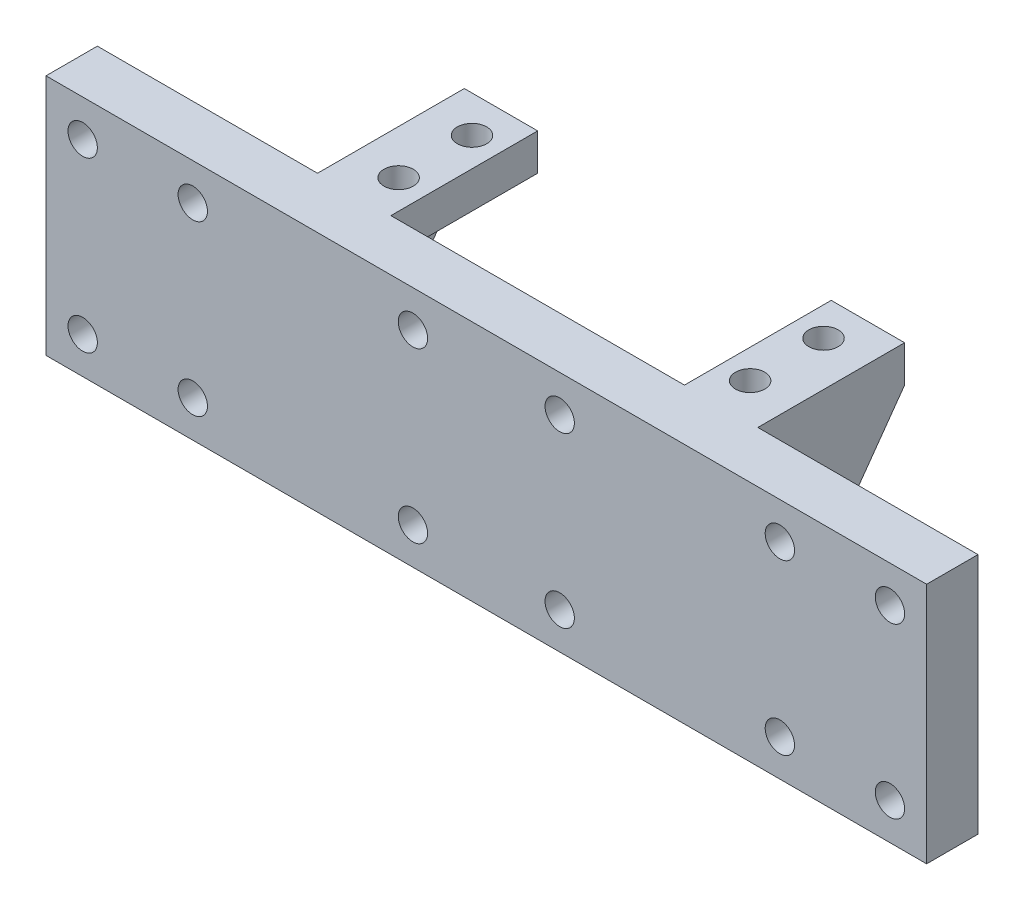
ISO-10303-21;
HEADER;
FILE_DESCRIPTION(('STEP AP214'),'2;1');
FILE_NAME('part.step','',(''),(''),'','','');
FILE_SCHEMA(('AUTOMOTIVE_DESIGN { 1 0 10303 214 1 1 1 1 }'));
ENDSEC;
DATA;
#1=APPLICATION_CONTEXT('core data for automotive mechanical design processes');
#2=APPLICATION_PROTOCOL_DEFINITION('international standard','automotive_design',2000,#1);
#3=PRODUCT_CONTEXT('',#1,'mechanical');
#4=PRODUCT('Part','Part','',(#3));
#5=PRODUCT_RELATED_PRODUCT_CATEGORY('part','',(#4));
#6=PRODUCT_DEFINITION_FORMATION('','',#4);
#7=PRODUCT_DEFINITION_CONTEXT('part definition',#1,'design');
#8=PRODUCT_DEFINITION('design','',#6,#7);
#9=PRODUCT_DEFINITION_SHAPE('','',#8);
#10=(LENGTH_UNIT() NAMED_UNIT(*) SI_UNIT(.MILLI.,.METRE.));
#11=(NAMED_UNIT(*) PLANE_ANGLE_UNIT() SI_UNIT($,.RADIAN.));
#12=(NAMED_UNIT(*) SI_UNIT($,.STERADIAN.) SOLID_ANGLE_UNIT());
#13=UNCERTAINTY_MEASURE_WITH_UNIT(LENGTH_MEASURE(1.E-05),#10,'distance_accuracy_value','');
#14=(GEOMETRIC_REPRESENTATION_CONTEXT(3) GLOBAL_UNCERTAINTY_ASSIGNED_CONTEXT((#13)) GLOBAL_UNIT_ASSIGNED_CONTEXT((#10,
#11,#12)) REPRESENTATION_CONTEXT('',''));
#15=CARTESIAN_POINT('',(0.,0.,0.));
#16=DIRECTION('',(0.,0.,1.));
#17=DIRECTION('',(1.,0.,0.));
#18=AXIS2_PLACEMENT_3D('',#15,#16,#17);
#19=CARTESIAN_POINT('',(50.,0.,0.));
#20=DIRECTION('',(-1.,0.,0.));
#21=DIRECTION('',(0.,0.,1.));
#22=AXIS2_PLACEMENT_3D('',#19,#20,#21);
#23=PLANE('',#22);
#24=DIRECTION('',(0.,1.,0.));
#25=VECTOR('',#24,1.);
#26=CARTESIAN_POINT('',(50.,-58.8058436014987,0.));
#27=LINE('',#26,#25);
#28=CARTESIAN_POINT('',(50.,-28.,0.));
#29=VERTEX_POINT('',#28);
#30=CARTESIAN_POINT('',(50.,5.,0.));
#31=VERTEX_POINT('',#30);
#32=EDGE_CURVE('E181',#29,#31,#27,.T.);
#33=ORIENTED_EDGE('',*,*,#32,.F.);
#34=DIRECTION('',(0.,0.813733471206735,-0.581238193719096));
#35=VECTOR('',#34,1.);
#36=CARTESIAN_POINT('',(50.,0.,-20.));
#37=LINE('',#36,#35);
#38=CARTESIAN_POINT('',(50.,0.,-20.));
#39=VERTEX_POINT('',#38);
#40=EDGE_CURVE('E193',#29,#39,#37,.T.);
#41=ORIENTED_EDGE('',*,*,#40,.T.);
#42=DIRECTION('',(0.,1.,0.));
#43=VECTOR('',#42,1.);
#44=CARTESIAN_POINT('',(50.,-28.,-20.));
#45=LINE('',#44,#43);
#46=CARTESIAN_POINT('',(50.,5.,-20.));
#47=VERTEX_POINT('',#46);
#48=EDGE_CURVE('E210',#39,#47,#45,.T.);
#49=ORIENTED_EDGE('',*,*,#48,.T.);
#50=DIRECTION('',(0.,0.,1.));
#51=VECTOR('',#50,1.);
#52=CARTESIAN_POINT('',(50.,5.,7.));
#53=LINE('',#52,#51);
#54=EDGE_CURVE('E212',#47,#31,#53,.T.);
#55=ORIENTED_EDGE('',*,*,#54,.T.);
#56=EDGE_LOOP('',(#33,#41,#49,#55));
#57=FACE_BOUND('',#56,.T.);
#58=ADVANCED_FACE('F35',(#57),#23,.F.);
#59=CARTESIAN_POINT('',(-10.,0.,0.));
#60=DIRECTION('',(-1.,0.,0.));
#61=DIRECTION('',(0.,0.,1.));
#62=AXIS2_PLACEMENT_3D('',#59,#60,#61);
#63=PLANE('',#62);
#64=DIRECTION('',(0.,0.813733471206735,-0.581238193719096));
#65=VECTOR('',#64,1.);
#66=CARTESIAN_POINT('',(-10.,0.,-20.));
#67=LINE('',#66,#65);
#68=CARTESIAN_POINT('',(-10.,-28.,0.));
#69=VERTEX_POINT('',#68);
#70=CARTESIAN_POINT('',(-10.,0.,-20.));
#71=VERTEX_POINT('',#70);
#72=EDGE_CURVE('E191',#69,#71,#67,.T.);
#73=ORIENTED_EDGE('',*,*,#72,.F.);
#74=DIRECTION('',(0.,1.,0.));
#75=VECTOR('',#74,1.);
#76=CARTESIAN_POINT('',(-10.,-58.8058436014987,0.));
#77=LINE('',#76,#75);
#78=CARTESIAN_POINT('',(-10.,5.,0.));
#79=VERTEX_POINT('',#78);
#80=EDGE_CURVE('E188',#69,#79,#77,.T.);
#81=ORIENTED_EDGE('',*,*,#80,.T.);
#82=DIRECTION('',(0.,0.,-1.));
#83=VECTOR('',#82,1.);
#84=CARTESIAN_POINT('',(-10.,5.,-20.));
#85=LINE('',#84,#83);
#86=CARTESIAN_POINT('',(-10.,5.,-20.));
#87=VERTEX_POINT('',#86);
#88=EDGE_CURVE('E208',#79,#87,#85,.T.);
#89=ORIENTED_EDGE('',*,*,#88,.T.);
#90=DIRECTION('',(0.,-1.,0.));
#91=VECTOR('',#90,1.);
#92=CARTESIAN_POINT('',(-10.,5.,-20.));
#93=LINE('',#92,#91);
#94=EDGE_CURVE('E205',#87,#71,#93,.T.);
#95=ORIENTED_EDGE('',*,*,#94,.T.);
#96=EDGE_LOOP('',(#73,#81,#89,#95));
#97=FACE_BOUND('',#96,.T.);
#98=ADVANCED_FACE('F330',(#97),#63,.T.);
#99=CARTESIAN_POINT('',(0.,0.,0.));
#100=DIRECTION('',(0.,1.,0.));
#101=DIRECTION('',(0.,0.,1.));
#102=AXIS2_PLACEMENT_3D('',#99,#100,#101);
#103=PLANE('',#102);
#104=CARTESIAN_POINT('',(43.95,0.,-15.));
#105=DIRECTION('',(0.,-1.,0.));
#106=DIRECTION('',(0.,0.,-1.));
#107=AXIS2_PLACEMENT_3D('',#104,#105,#106);
#108=CIRCLE('',#107,2.);
#109=CARTESIAN_POINT('',(43.95,0.,-17.));
#110=VERTEX_POINT('',#109);
#111=EDGE_CURVE('E223',#110,#110,#108,.T.);
#112=ORIENTED_EDGE('',*,*,#111,.F.);
#113=EDGE_LOOP('',(#112));
#114=FACE_BOUND('',#113,.T.);
#115=CARTESIAN_POINT('',(43.95,0.,-5.00000000000001));
#116=DIRECTION('',(0.,-1.,0.));
#117=DIRECTION('',(0.,0.,-1.));
#118=AXIS2_PLACEMENT_3D('',#115,#116,#117);
#119=CIRCLE('',#118,2.);
#120=CARTESIAN_POINT('',(43.95,0.,-7.00000000000001));
#121=VERTEX_POINT('',#120);
#122=EDGE_CURVE('E230',#121,#121,#119,.T.);
#123=ORIENTED_EDGE('',*,*,#122,.F.);
#124=EDGE_LOOP('',(#123));
#125=FACE_BOUND('',#124,.T.);
#126=DIRECTION('',(-1.,0.,0.));
#127=VECTOR('',#126,1.);
#128=CARTESIAN_POINT('',(76.8617393793236,0.,0.));
#129=LINE('',#128,#127);
#130=CARTESIAN_POINT('',(48.,0.,0.));
#131=VERTEX_POINT('',#130);
#132=CARTESIAN_POINT('',(40.,0.,0.));
#133=VERTEX_POINT('',#132);
#134=EDGE_CURVE('E214',#131,#133,#129,.T.);
#135=ORIENTED_EDGE('',*,*,#134,.T.);
#136=DIRECTION('',(0.,0.,-1.));
#137=VECTOR('',#136,1.);
#138=CARTESIAN_POINT('',(40.,0.,0.));
#139=LINE('',#138,#137);
#140=CARTESIAN_POINT('',(40.,0.,-20.));
#141=VERTEX_POINT('',#140);
#142=EDGE_CURVE('E280',#133,#141,#139,.T.);
#143=ORIENTED_EDGE('',*,*,#142,.T.);
#144=DIRECTION('',(1.,0.,0.));
#145=VECTOR('',#144,1.);
#146=CARTESIAN_POINT('',(0.,0.,-20.));
#147=LINE('',#146,#145);
#148=CARTESIAN_POINT('',(48.,0.,-20.));
#149=VERTEX_POINT('',#148);
#150=EDGE_CURVE('E277',#141,#149,#147,.T.);
#151=ORIENTED_EDGE('',*,*,#150,.T.);
#152=DIRECTION('',(0.,0.,1.));
#153=VECTOR('',#152,1.);
#154=CARTESIAN_POINT('',(48.,0.,0.));
#155=LINE('',#154,#153);
#156=EDGE_CURVE('E274',#149,#131,#155,.T.);
#157=ORIENTED_EDGE('',*,*,#156,.T.);
#158=EDGE_LOOP('',(#135,#143,#151,#157));
#159=FACE_BOUND('',#158,.T.);
#160=ADVANCED_FACE('F298',(#114,#125,#159),#103,.F.);
#161=CARTESIAN_POINT('',(-3.95,0.,-15.));
#162=DIRECTION('',(0.,-1.,0.));
#163=DIRECTION('',(0.,0.,-1.));
#164=AXIS2_PLACEMENT_3D('',#161,#162,#163);
#165=CIRCLE('',#164,2.);
#166=CARTESIAN_POINT('',(-3.95,0.,-17.));
#167=VERTEX_POINT('',#166);
#168=EDGE_CURVE('E218',#167,#167,#165,.T.);
#169=ORIENTED_EDGE('',*,*,#168,.F.);
#170=EDGE_LOOP('',(#169));
#171=FACE_BOUND('',#170,.T.);
#172=CARTESIAN_POINT('',(-3.95,0.,-5.00000000000001));
#173=DIRECTION('',(0.,-1.,0.));
#174=DIRECTION('',(0.,0.,-1.));
#175=AXIS2_PLACEMENT_3D('',#172,#173,#174);
#176=CIRCLE('',#175,2.);
#177=CARTESIAN_POINT('',(-3.95,0.,-7.00000000000001));
#178=VERTEX_POINT('',#177);
#179=EDGE_CURVE('E224',#178,#178,#176,.T.);
#180=ORIENTED_EDGE('',*,*,#179,.F.);
#181=EDGE_LOOP('',(#180));
#182=FACE_BOUND('',#181,.T.);
#183=DIRECTION('',(1.,0.,0.));
#184=VECTOR('',#183,1.);
#185=CARTESIAN_POINT('',(0.,0.,0.));
#186=LINE('',#185,#184);
#187=CARTESIAN_POINT('',(-8.,0.,0.));
#188=VERTEX_POINT('',#187);
#189=CARTESIAN_POINT('',(0.,0.,0.));
#190=VERTEX_POINT('',#189);
#191=EDGE_CURVE('E241',#188,#190,#186,.T.);
#192=ORIENTED_EDGE('',*,*,#191,.F.);
#193=DIRECTION('',(0.,0.,1.));
#194=VECTOR('',#193,1.);
#195=CARTESIAN_POINT('',(-8.,0.,0.));
#196=LINE('',#195,#194);
#197=CARTESIAN_POINT('',(-8.00000000000001,0.,-20.));
#198=VERTEX_POINT('',#197);
#199=EDGE_CURVE('E272',#198,#188,#196,.T.);
#200=ORIENTED_EDGE('',*,*,#199,.F.);
#201=DIRECTION('',(-1.,0.,0.));
#202=VECTOR('',#201,1.);
#203=CARTESIAN_POINT('',(0.,0.,-20.));
#204=LINE('',#203,#202);
#205=CARTESIAN_POINT('',(0.,0.,-20.));
#206=VERTEX_POINT('',#205);
#207=EDGE_CURVE('E250',#206,#198,#204,.T.);
#208=ORIENTED_EDGE('',*,*,#207,.F.);
#209=DIRECTION('',(0.,0.,1.));
#210=VECTOR('',#209,1.);
#211=CARTESIAN_POINT('',(0.,0.,0.));
#212=LINE('',#211,#210);
#213=EDGE_CURVE('E255',#206,#190,#212,.T.);
#214=ORIENTED_EDGE('',*,*,#213,.T.);
#215=EDGE_LOOP('',(#192,#200,#208,#214));
#216=FACE_BOUND('',#215,.T.);
#217=ADVANCED_FACE('F315',(#171,#182,#216),#103,.F.);
#218=CARTESIAN_POINT('',(0.,5.,-20.));
#219=DIRECTION('',(0.,0.,1.));
#220=DIRECTION('',(1.,0.,0.));
#221=AXIS2_PLACEMENT_3D('',#218,#219,#220);
#222=PLANE('',#221);
#223=ORIENTED_EDGE('',*,*,#207,.T.);
#224=DIRECTION('',(-1.,0.,0.));
#225=VECTOR('',#224,1.);
#226=CARTESIAN_POINT('',(50.,0.,-20.));
#227=LINE('',#226,#225);
#228=EDGE_CURVE('E198',#198,#71,#227,.T.);
#229=ORIENTED_EDGE('',*,*,#228,.T.);
#230=ORIENTED_EDGE('',*,*,#94,.F.);
#231=DIRECTION('',(-1.,0.,0.));
#232=VECTOR('',#231,1.);
#233=CARTESIAN_POINT('',(0.,5.,-20.));
#234=LINE('',#233,#232);
#235=CARTESIAN_POINT('',(0.,5.,-20.));
#236=VERTEX_POINT('',#235);
#237=EDGE_CURVE('E251',#236,#87,#234,.T.);
#238=ORIENTED_EDGE('',*,*,#237,.F.);
#239=DIRECTION('',(0.,-1.,0.));
#240=VECTOR('',#239,1.);
#241=CARTESIAN_POINT('',(0.,5.,-20.));
#242=LINE('',#241,#240);
#243=EDGE_CURVE('E269',#236,#206,#242,.T.);
#244=ORIENTED_EDGE('',*,*,#243,.T.);
#245=EDGE_LOOP('',(#223,#229,#230,#238,#244));
#246=FACE_BOUND('',#245,.T.);
#247=ADVANCED_FACE('F37',(#246),#222,.F.);
#248=CARTESIAN_POINT('',(0.,5.,7.));
#249=DIRECTION('',(0.,0.,-1.));
#250=DIRECTION('',(-1.,0.,0.));
#251=AXIS2_PLACEMENT_3D('',#248,#249,#250);
#252=PLANE('',#251);
#253=CARTESIAN_POINT('',(60.,0.,7.00000000000001));
#254=DIRECTION('',(0.,0.,-1.));
#255=DIRECTION('',(-1.,0.,0.));
#256=AXIS2_PLACEMENT_3D('',#253,#254,#255);
#257=CIRCLE('',#256,2.);
#258=CARTESIAN_POINT('',(58.,0.,7.00000000000001));
#259=VERTEX_POINT('',#258);
#260=EDGE_CURVE('E379',#259,#259,#257,.T.);
#261=ORIENTED_EDGE('',*,*,#260,.T.);
#262=EDGE_LOOP('',(#261));
#263=FACE_BOUND('',#262,.T.);
#264=CARTESIAN_POINT('',(30.,0.,7.00000000000001));
#265=DIRECTION('',(0.,0.,-1.));
#266=DIRECTION('',(-1.,0.,0.));
#267=AXIS2_PLACEMENT_3D('',#264,#265,#266);
#268=CIRCLE('',#267,2.);
#269=CARTESIAN_POINT('',(28.,0.,7.00000000000001));
#270=VERTEX_POINT('',#269);
#271=EDGE_CURVE('E386',#270,#270,#268,.T.);
#272=ORIENTED_EDGE('',*,*,#271,.T.);
#273=EDGE_LOOP('',(#272));
#274=FACE_BOUND('',#273,.T.);
#275=CARTESIAN_POINT('',(30.,-23.,7.00000000000001));
#276=DIRECTION('',(0.,0.,-1.));
#277=DIRECTION('',(-1.,0.,0.));
#278=AXIS2_PLACEMENT_3D('',#275,#276,#277);
#279=CIRCLE('',#278,2.);
#280=CARTESIAN_POINT('',(28.,-23.,7.00000000000001));
#281=VERTEX_POINT('',#280);
#282=EDGE_CURVE('E392',#281,#281,#279,.T.);
#283=ORIENTED_EDGE('',*,*,#282,.T.);
#284=EDGE_LOOP('',(#283));
#285=FACE_BOUND('',#284,.T.);
#286=CARTESIAN_POINT('',(10.,-23.,7.00000000000001));
#287=DIRECTION('',(0.,0.,-1.));
#288=DIRECTION('',(-1.,0.,0.));
#289=AXIS2_PLACEMENT_3D('',#286,#287,#288);
#290=CIRCLE('',#289,2.);
#291=CARTESIAN_POINT('',(8.,-23.,7.00000000000001));
#292=VERTEX_POINT('',#291);
#293=EDGE_CURVE('E368',#292,#292,#290,.T.);
#294=ORIENTED_EDGE('',*,*,#293,.T.);
#295=EDGE_LOOP('',(#294));
#296=FACE_BOUND('',#295,.T.);
#297=CARTESIAN_POINT('',(-20.,0.,7.00000000000002));
#298=DIRECTION('',(0.,0.,-1.));
#299=DIRECTION('',(-1.,0.,0.));
#300=AXIS2_PLACEMENT_3D('',#297,#298,#299);
#301=CIRCLE('',#300,2.);
#302=CARTESIAN_POINT('',(-22.,0.,7.00000000000002));
#303=VERTEX_POINT('',#302);
#304=EDGE_CURVE('E349',#303,#303,#301,.T.);
#305=ORIENTED_EDGE('',*,*,#304,.T.);
#306=EDGE_LOOP('',(#305));
#307=FACE_BOUND('',#306,.T.);
#308=CARTESIAN_POINT('',(-35.,-23.,7.00000000000002));
#309=DIRECTION('',(0.,0.,-1.));
#310=DIRECTION('',(-1.,0.,0.));
#311=AXIS2_PLACEMENT_3D('',#308,#309,#310);
#312=CIRCLE('',#311,2.);
#313=CARTESIAN_POINT('',(-37.,-23.,7.00000000000002));
#314=VERTEX_POINT('',#313);
#315=EDGE_CURVE('E355',#314,#314,#312,.T.);
#316=ORIENTED_EDGE('',*,*,#315,.T.);
#317=EDGE_LOOP('',(#316));
#318=FACE_BOUND('',#317,.T.);
#319=CARTESIAN_POINT('',(-35.,0.,7.00000000000002));
#320=DIRECTION('',(0.,0.,-1.));
#321=DIRECTION('',(-1.,0.,0.));
#322=AXIS2_PLACEMENT_3D('',#319,#320,#321);
#323=CIRCLE('',#322,2.);
#324=CARTESIAN_POINT('',(-37.,0.,7.00000000000002));
#325=VERTEX_POINT('',#324);
#326=EDGE_CURVE('E356',#325,#325,#323,.T.);
#327=ORIENTED_EDGE('',*,*,#326,.T.);
#328=EDGE_LOOP('',(#327));
#329=FACE_BOUND('',#328,.T.);
#330=CARTESIAN_POINT('',(10.,0.,7.00000000000001));
#331=DIRECTION('',(0.,0.,-1.));
#332=DIRECTION('',(-1.,0.,0.));
#333=AXIS2_PLACEMENT_3D('',#330,#331,#332);
#334=CIRCLE('',#333,2.);
#335=CARTESIAN_POINT('',(8.,0.,7.00000000000001));
#336=VERTEX_POINT('',#335);
#337=EDGE_CURVE('E367',#336,#336,#334,.T.);
#338=ORIENTED_EDGE('',*,*,#337,.T.);
#339=EDGE_LOOP('',(#338));
#340=FACE_BOUND('',#339,.T.);
#341=CARTESIAN_POINT('',(60.,-23.,7.00000000000001));
#342=DIRECTION('',(0.,0.,-1.));
#343=DIRECTION('',(-1.,0.,0.));
#344=AXIS2_PLACEMENT_3D('',#341,#342,#343);
#345=CIRCLE('',#344,2.);
#346=CARTESIAN_POINT('',(58.,-23.,7.00000000000001));
#347=VERTEX_POINT('',#346);
#348=EDGE_CURVE('E380',#347,#347,#345,.T.);
#349=ORIENTED_EDGE('',*,*,#348,.T.);
#350=EDGE_LOOP('',(#349));
#351=FACE_BOUND('',#350,.T.);
#352=CARTESIAN_POINT('',(75.,-23.,7.));
#353=DIRECTION('',(0.,0.,-1.));
#354=DIRECTION('',(-1.,0.,0.));
#355=AXIS2_PLACEMENT_3D('',#352,#353,#354);
#356=CIRCLE('',#355,2.);
#357=CARTESIAN_POINT('',(73.,-23.,7.));
#358=VERTEX_POINT('',#357);
#359=EDGE_CURVE('E409',#358,#358,#356,.T.);
#360=ORIENTED_EDGE('',*,*,#359,.T.);
#361=EDGE_LOOP('',(#360));
#362=FACE_BOUND('',#361,.T.);
#363=CARTESIAN_POINT('',(75.,0.,7.));
#364=DIRECTION('',(0.,0.,-1.));
#365=DIRECTION('',(-1.,0.,0.));
#366=AXIS2_PLACEMENT_3D('',#363,#364,#365);
#367=CIRCLE('',#366,2.);
#368=CARTESIAN_POINT('',(73.,0.,7.));
#369=VERTEX_POINT('',#368);
#370=EDGE_CURVE('E403',#369,#369,#367,.T.);
#371=ORIENTED_EDGE('',*,*,#370,.T.);
#372=EDGE_LOOP('',(#371));
#373=FACE_BOUND('',#372,.T.);
#374=CARTESIAN_POINT('',(-20.,-23.,7.00000000000002));
#375=DIRECTION('',(0.,0.,-1.));
#376=DIRECTION('',(-1.,0.,0.));
#377=AXIS2_PLACEMENT_3D('',#374,#375,#376);
#378=CIRCLE('',#377,2.);
#379=CARTESIAN_POINT('',(-22.,-23.,7.00000000000002));
#380=VERTEX_POINT('',#379);
#381=EDGE_CURVE('E338',#380,#380,#378,.T.);
#382=ORIENTED_EDGE('',*,*,#381,.T.);
#383=EDGE_LOOP('',(#382));
#384=FACE_BOUND('',#383,.T.);
#385=DIRECTION('',(-1.,0.,0.));
#386=VECTOR('',#385,1.);
#387=CARTESIAN_POINT('',(0.,-28.,7.));
#388=LINE('',#387,#386);
#389=CARTESIAN_POINT('',(80.,-28.,6.99999999999999));
#390=VERTEX_POINT('',#389);
#391=CARTESIAN_POINT('',(-40.,-28.,7.));
#392=VERTEX_POINT('',#391);
#393=EDGE_CURVE('E143',#390,#392,#388,.T.);
#394=ORIENTED_EDGE('',*,*,#393,.F.);
#395=DIRECTION('',(0.,1.,0.));
#396=VECTOR('',#395,1.);
#397=CARTESIAN_POINT('',(80.,-58.8058436014987,6.99999999999999));
#398=LINE('',#397,#396);
#399=CARTESIAN_POINT('',(80.,5.,6.99999999999999));
#400=VERTEX_POINT('',#399);
#401=EDGE_CURVE('E147',#390,#400,#398,.T.);
#402=ORIENTED_EDGE('',*,*,#401,.T.);
#403=DIRECTION('',(1.,0.,0.));
#404=VECTOR('',#403,1.);
#405=CARTESIAN_POINT('',(0.,5.,7.));
#406=LINE('',#405,#404);
#407=CARTESIAN_POINT('',(-40.,5.,7.));
#408=VERTEX_POINT('',#407);
#409=EDGE_CURVE('E254',#408,#400,#406,.T.);
#410=ORIENTED_EDGE('',*,*,#409,.F.);
#411=DIRECTION('',(0.,1.,0.));
#412=VECTOR('',#411,1.);
#413=CARTESIAN_POINT('',(-40.,-58.8058436014987,7.));
#414=LINE('',#413,#412);
#415=EDGE_CURVE('E150',#392,#408,#414,.T.);
#416=ORIENTED_EDGE('',*,*,#415,.F.);
#417=EDGE_LOOP('',(#394,#402,#410,#416));
#418=FACE_BOUND('',#417,.T.);
#419=ADVANCED_FACE('F145',(#263,#274,#285,#296,#307,#318,#329,#340,#351,#362,#373,#384,#418),
#252,.F.);
#420=CARTESIAN_POINT('',(0.,5.,-20.));
#421=DIRECTION('',(0.,0.,-1.));
#422=DIRECTION('',(-1.,0.,0.));
#423=AXIS2_PLACEMENT_3D('',#420,#421,#422);
#424=PLANE('',#423);
#425=EDGE_CURVE('E58',#39,#149,#227,.T.);
#426=ORIENTED_EDGE('',*,*,#425,.T.);
#427=ORIENTED_EDGE('',*,*,#150,.F.);
#428=DIRECTION('',(0.,-1.,0.));
#429=VECTOR('',#428,1.);
#430=CARTESIAN_POINT('',(40.,5.,-20.));
#431=LINE('',#430,#429);
#432=CARTESIAN_POINT('',(40.,5.,-20.));
#433=VERTEX_POINT('',#432);
#434=EDGE_CURVE('E11',#433,#141,#431,.T.);
#435=ORIENTED_EDGE('',*,*,#434,.F.);
#436=DIRECTION('',(1.,0.,0.));
#437=VECTOR('',#436,1.);
#438=CARTESIAN_POINT('',(0.,5.,-20.));
#439=LINE('',#438,#437);
#440=EDGE_CURVE('E257',#433,#47,#439,.T.);
#441=ORIENTED_EDGE('',*,*,#440,.T.);
#442=ORIENTED_EDGE('',*,*,#48,.F.);
#443=EDGE_LOOP('',(#426,#427,#435,#441,#442));
#444=FACE_BOUND('',#443,.T.);
#445=ADVANCED_FACE('F488',(#444),#424,.T.);
#446=CARTESIAN_POINT('',(40.,5.,0.));
#447=DIRECTION('',(-1.,0.,0.));
#448=DIRECTION('',(0.,0.,1.));
#449=AXIS2_PLACEMENT_3D('',#446,#447,#448);
#450=PLANE('',#449);
#451=ORIENTED_EDGE('',*,*,#142,.F.);
#452=DIRECTION('',(0.,-1.,0.));
#453=VECTOR('',#452,1.);
#454=CARTESIAN_POINT('',(40.,5.,0.));
#455=LINE('',#454,#453);
#456=CARTESIAN_POINT('',(40.,5.,0.));
#457=VERTEX_POINT('',#456);
#458=EDGE_CURVE('E43',#457,#133,#455,.T.);
#459=ORIENTED_EDGE('',*,*,#458,.F.);
#460=DIRECTION('',(0.,0.,-1.));
#461=VECTOR('',#460,1.);
#462=CARTESIAN_POINT('',(40.,5.,0.));
#463=LINE('',#462,#461);
#464=EDGE_CURVE('E260',#457,#433,#463,.T.);
#465=ORIENTED_EDGE('',*,*,#464,.T.);
#466=ORIENTED_EDGE('',*,*,#434,.T.);
#467=EDGE_LOOP('',(#451,#459,#465,#466));
#468=FACE_BOUND('',#467,.T.);
#469=ADVANCED_FACE('F295',(#468),#450,.T.);
#470=CARTESIAN_POINT('',(0.,5.,0.));
#471=DIRECTION('',(0.,0.,-1.));
#472=DIRECTION('',(-1.,0.,0.));
#473=AXIS2_PLACEMENT_3D('',#470,#471,#472);
#474=PLANE('',#473);
#475=CARTESIAN_POINT('',(30.,0.,0.));
#476=DIRECTION('',(0.,0.,-1.));
#477=DIRECTION('',(-1.,0.,0.));
#478=AXIS2_PLACEMENT_3D('',#475,#476,#477);
#479=CIRCLE('',#478,2.);
#480=CARTESIAN_POINT('',(28.,0.,0.));
#481=VERTEX_POINT('',#480);
#482=EDGE_CURVE('E383',#481,#481,#479,.T.);
#483=ORIENTED_EDGE('',*,*,#482,.F.);
#484=EDGE_LOOP('',(#483));
#485=FACE_BOUND('',#484,.T.);
#486=CARTESIAN_POINT('',(30.,-23.,0.));
#487=DIRECTION('',(0.,0.,-1.));
#488=DIRECTION('',(-1.,0.,0.));
#489=AXIS2_PLACEMENT_3D('',#486,#487,#488);
#490=CIRCLE('',#489,2.);
#491=CARTESIAN_POINT('',(28.,-23.,0.));
#492=VERTEX_POINT('',#491);
#493=EDGE_CURVE('E389',#492,#492,#490,.T.);
#494=ORIENTED_EDGE('',*,*,#493,.F.);
#495=EDGE_LOOP('',(#494));
#496=FACE_BOUND('',#495,.T.);
#497=CARTESIAN_POINT('',(10.,-23.,0.));
#498=DIRECTION('',(0.,0.,-1.));
#499=DIRECTION('',(-1.,0.,0.));
#500=AXIS2_PLACEMENT_3D('',#497,#498,#499);
#501=CIRCLE('',#500,2.);
#502=CARTESIAN_POINT('',(8.,-23.,0.));
#503=VERTEX_POINT('',#502);
#504=EDGE_CURVE('E395',#503,#503,#501,.T.);
#505=ORIENTED_EDGE('',*,*,#504,.F.);
#506=EDGE_LOOP('',(#505));
#507=FACE_BOUND('',#506,.T.);
#508=CARTESIAN_POINT('',(10.,0.,0.));
#509=DIRECTION('',(0.,0.,-1.));
#510=DIRECTION('',(-1.,0.,0.));
#511=AXIS2_PLACEMENT_3D('',#508,#509,#510);
#512=CIRCLE('',#511,2.);
#513=CARTESIAN_POINT('',(8.,0.,0.));
#514=VERTEX_POINT('',#513);
#515=EDGE_CURVE('E364',#514,#514,#512,.T.);
#516=ORIENTED_EDGE('',*,*,#515,.F.);
#517=EDGE_LOOP('',(#516));
#518=FACE_BOUND('',#517,.T.);
#519=ORIENTED_EDGE('',*,*,#458,.T.);
#520=ORIENTED_EDGE('',*,*,#134,.F.);
#521=DIRECTION('',(0.,1.,0.));
#522=VECTOR('',#521,1.);
#523=CARTESIAN_POINT('',(48.,-28.,0.));
#524=LINE('',#523,#522);
#525=CARTESIAN_POINT('',(48.,-28.,0.));
#526=VERTEX_POINT('',#525);
#527=EDGE_CURVE('E215',#526,#131,#524,.T.);
#528=ORIENTED_EDGE('',*,*,#527,.F.);
#529=DIRECTION('',(1.,0.,0.));
#530=VECTOR('',#529,1.);
#531=CARTESIAN_POINT('',(0.,-28.,0.));
#532=LINE('',#531,#530);
#533=CARTESIAN_POINT('',(-8.00000000000001,-28.,0.));
#534=VERTEX_POINT('',#533);
#535=EDGE_CURVE('E154',#534,#526,#532,.T.);
#536=ORIENTED_EDGE('',*,*,#535,.F.);
#537=DIRECTION('',(0.,1.,0.));
#538=VECTOR('',#537,1.);
#539=CARTESIAN_POINT('',(-8.,-28.,0.));
#540=LINE('',#539,#538);
#541=EDGE_CURVE('E153',#534,#188,#540,.T.);
#542=ORIENTED_EDGE('',*,*,#541,.T.);
#543=ORIENTED_EDGE('',*,*,#191,.T.);
#544=DIRECTION('',(0.,-1.,0.));
#545=VECTOR('',#544,1.);
#546=CARTESIAN_POINT('',(0.,5.,0.));
#547=LINE('',#546,#545);
#548=CARTESIAN_POINT('',(0.,5.,0.));
#549=VERTEX_POINT('',#548);
#550=EDGE_CURVE('E286',#549,#190,#547,.T.);
#551=ORIENTED_EDGE('',*,*,#550,.F.);
#552=DIRECTION('',(1.,0.,0.));
#553=VECTOR('',#552,1.);
#554=CARTESIAN_POINT('',(0.,5.,0.));
#555=LINE('',#554,#553);
#556=EDGE_CURVE('E263',#549,#457,#555,.T.);
#557=ORIENTED_EDGE('',*,*,#556,.T.);
#558=EDGE_LOOP('',(#519,#520,#528,#536,#542,#543,#551,#557));
#559=FACE_BOUND('',#558,.T.);
#560=ADVANCED_FACE('F290',(#485,#496,#507,#518,#559),#474,.T.);
#561=CARTESIAN_POINT('',(0.,5.,0.));
#562=DIRECTION('',(1.,0.,0.));
#563=DIRECTION('',(0.,0.,-1.));
#564=AXIS2_PLACEMENT_3D('',#561,#562,#563);
#565=PLANE('',#564);
#566=ORIENTED_EDGE('',*,*,#213,.F.);
#567=ORIENTED_EDGE('',*,*,#243,.F.);
#568=DIRECTION('',(0.,0.,1.));
#569=VECTOR('',#568,1.);
#570=CARTESIAN_POINT('',(0.,5.,0.));
#571=LINE('',#570,#569);
#572=EDGE_CURVE('E266',#236,#549,#571,.T.);
#573=ORIENTED_EDGE('',*,*,#572,.T.);
#574=ORIENTED_EDGE('',*,*,#550,.T.);
#575=EDGE_LOOP('',(#566,#567,#573,#574));
#576=FACE_BOUND('',#575,.T.);
#577=ADVANCED_FACE('F323',(#576),#565,.T.);
#578=CARTESIAN_POINT('',(0.,5.,0.));
#579=DIRECTION('',(0.,1.,0.));
#580=DIRECTION('',(0.,0.,1.));
#581=AXIS2_PLACEMENT_3D('',#578,#579,#580);
#582=PLANE('',#581);
#583=ORIENTED_EDGE('',*,*,#409,.T.);
#584=DIRECTION('',(0.,0.,-1.));
#585=VECTOR('',#584,1.);
#586=CARTESIAN_POINT('',(80.,5.,6.99999999999999));
#587=LINE('',#586,#585);
#588=CARTESIAN_POINT('',(80.,5.,0.));
#589=VERTEX_POINT('',#588);
#590=EDGE_CURVE('E168',#400,#589,#587,.T.);
#591=ORIENTED_EDGE('',*,*,#590,.T.);
#592=DIRECTION('',(-1.,0.,0.));
#593=VECTOR('',#592,1.);
#594=CARTESIAN_POINT('',(50.,5.,0.));
#595=LINE('',#594,#593);
#596=EDGE_CURVE('E169',#589,#31,#595,.T.);
#597=ORIENTED_EDGE('',*,*,#596,.T.);
#598=ORIENTED_EDGE('',*,*,#54,.F.);
#599=ORIENTED_EDGE('',*,*,#440,.F.);
#600=ORIENTED_EDGE('',*,*,#464,.F.);
#601=ORIENTED_EDGE('',*,*,#556,.F.);
#602=ORIENTED_EDGE('',*,*,#572,.F.);
#603=ORIENTED_EDGE('',*,*,#237,.T.);
#604=ORIENTED_EDGE('',*,*,#88,.F.);
#605=DIRECTION('',(-1.,0.,0.));
#606=VECTOR('',#605,1.);
#607=CARTESIAN_POINT('',(-10.,5.,0.));
#608=LINE('',#607,#606);
#609=CARTESIAN_POINT('',(-40.,5.,0.));
#610=VERTEX_POINT('',#609);
#611=EDGE_CURVE('E50',#79,#610,#608,.T.);
#612=ORIENTED_EDGE('',*,*,#611,.T.);
#613=DIRECTION('',(0.,0.,1.));
#614=VECTOR('',#613,1.);
#615=CARTESIAN_POINT('',(-40.,5.,7.));
#616=LINE('',#615,#614);
#617=EDGE_CURVE('E176',#610,#408,#616,.T.);
#618=ORIENTED_EDGE('',*,*,#617,.T.);
#619=EDGE_LOOP('',(#583,#591,#597,#598,#599,#600,#601,#602,#603,#604,#612,#618));
#620=FACE_BOUND('',#619,.T.);
#621=CARTESIAN_POINT('',(-3.95,5.,-15.));
#622=DIRECTION('',(0.,-1.,0.));
#623=DIRECTION('',(0.,0.,-1.));
#624=AXIS2_PLACEMENT_3D('',#621,#622,#623);
#625=CIRCLE('',#624,2.);
#626=CARTESIAN_POINT('',(-3.95,5.,-17.));
#627=VERTEX_POINT('',#626);
#628=EDGE_CURVE('E233',#627,#627,#625,.T.);
#629=ORIENTED_EDGE('',*,*,#628,.T.);
#630=EDGE_LOOP('',(#629));
#631=FACE_BOUND('',#630,.T.);
#632=CARTESIAN_POINT('',(43.95,5.,-5.00000000000001));
#633=DIRECTION('',(0.,-1.,0.));
#634=DIRECTION('',(0.,0.,-1.));
#635=AXIS2_PLACEMENT_3D('',#632,#633,#634);
#636=CIRCLE('',#635,2.);
#637=CARTESIAN_POINT('',(43.95,5.,-7.00000000000001));
#638=VERTEX_POINT('',#637);
#639=EDGE_CURVE('E227',#638,#638,#636,.T.);
#640=ORIENTED_EDGE('',*,*,#639,.T.);
#641=EDGE_LOOP('',(#640));
#642=FACE_BOUND('',#641,.T.);
#643=CARTESIAN_POINT('',(-3.95,5.,-5.00000000000001));
#644=DIRECTION('',(0.,-1.,0.));
#645=DIRECTION('',(0.,0.,-1.));
#646=AXIS2_PLACEMENT_3D('',#643,#644,#645);
#647=CIRCLE('',#646,2.);
#648=CARTESIAN_POINT('',(-3.95,5.,-7.00000000000001));
#649=VERTEX_POINT('',#648);
#650=EDGE_CURVE('E220',#649,#649,#647,.T.);
#651=ORIENTED_EDGE('',*,*,#650,.T.);
#652=EDGE_LOOP('',(#651));
#653=FACE_BOUND('',#652,.T.);
#654=CARTESIAN_POINT('',(43.95,5.,-15.));
#655=DIRECTION('',(0.,-1.,0.));
#656=DIRECTION('',(0.,0.,-1.));
#657=AXIS2_PLACEMENT_3D('',#654,#655,#656);
#658=CIRCLE('',#657,2.);
#659=CARTESIAN_POINT('',(43.95,5.,-17.));
#660=VERTEX_POINT('',#659);
#661=EDGE_CURVE('E238',#660,#660,#658,.T.);
#662=ORIENTED_EDGE('',*,*,#661,.T.);
#663=EDGE_LOOP('',(#662));
#664=FACE_BOUND('',#663,.T.);
#665=ADVANCED_FACE('F320',(#620,#631,#642,#653,#664),#582,.T.);
#666=CARTESIAN_POINT('',(0.,-28.,0.));
#667=DIRECTION('',(0.,-1.,0.));
#668=DIRECTION('',(0.,0.,-1.));
#669=AXIS2_PLACEMENT_3D('',#666,#667,#668);
#670=PLANE('',#669);
#671=ORIENTED_EDGE('',*,*,#393,.T.);
#672=DIRECTION('',(0.,0.,1.));
#673=VECTOR('',#672,1.);
#674=CARTESIAN_POINT('',(-40.,-28.,7.));
#675=LINE('',#674,#673);
#676=CARTESIAN_POINT('',(-40.,-28.,0.));
#677=VERTEX_POINT('',#676);
#678=EDGE_CURVE('E185',#677,#392,#675,.T.);
#679=ORIENTED_EDGE('',*,*,#678,.F.);
#680=DIRECTION('',(-1.,0.,0.));
#681=VECTOR('',#680,1.);
#682=CARTESIAN_POINT('',(-10.,-28.,0.));
#683=LINE('',#682,#681);
#684=EDGE_CURVE('E179',#69,#677,#683,.T.);
#685=ORIENTED_EDGE('',*,*,#684,.F.);
#686=DIRECTION('',(-1.,0.,0.));
#687=VECTOR('',#686,1.);
#688=CARTESIAN_POINT('',(50.,-28.,0.));
#689=LINE('',#688,#687);
#690=EDGE_CURVE('E195',#534,#69,#689,.T.);
#691=ORIENTED_EDGE('',*,*,#690,.F.);
#692=ORIENTED_EDGE('',*,*,#535,.T.);
#693=EDGE_CURVE('E199',#29,#526,#689,.T.);
#694=ORIENTED_EDGE('',*,*,#693,.F.);
#695=DIRECTION('',(-1.,0.,0.));
#696=VECTOR('',#695,1.);
#697=CARTESIAN_POINT('',(50.,-28.,0.));
#698=LINE('',#697,#696);
#699=CARTESIAN_POINT('',(80.,-28.,0.));
#700=VERTEX_POINT('',#699);
#701=EDGE_CURVE('E161',#700,#29,#698,.T.);
#702=ORIENTED_EDGE('',*,*,#701,.F.);
#703=DIRECTION('',(0.,0.,-1.));
#704=VECTOR('',#703,1.);
#705=CARTESIAN_POINT('',(80.,-28.,6.99999999999999));
#706=LINE('',#705,#704);
#707=EDGE_CURVE('E157',#390,#700,#706,.T.);
#708=ORIENTED_EDGE('',*,*,#707,.F.);
#709=EDGE_LOOP('',(#671,#679,#685,#691,#692,#694,#702,#708));
#710=FACE_BOUND('',#709,.T.);
#711=ADVANCED_FACE('F158',(#710),#670,.T.);
#712=CARTESIAN_POINT('',(43.95,5.,-15.));
#713=DIRECTION('',(0.,-1.,0.));
#714=DIRECTION('',(0.,0.,-1.));
#715=AXIS2_PLACEMENT_3D('',#712,#713,#714);
#716=CYLINDRICAL_SURFACE('',#715,2.);
#717=ORIENTED_EDGE('',*,*,#661,.F.);
#718=EDGE_LOOP('',(#717));
#719=FACE_BOUND('',#718,.T.);
#720=ORIENTED_EDGE('',*,*,#111,.T.);
#721=EDGE_LOOP('',(#720));
#722=FACE_BOUND('',#721,.T.);
#723=ADVANCED_FACE('F466',(#719,#722),#716,.F.);
#724=CARTESIAN_POINT('',(43.95,5.,-5.00000000000001));
#725=DIRECTION('',(0.,-1.,0.));
#726=DIRECTION('',(0.,0.,-1.));
#727=AXIS2_PLACEMENT_3D('',#724,#725,#726);
#728=CYLINDRICAL_SURFACE('',#727,2.);
#729=ORIENTED_EDGE('',*,*,#639,.F.);
#730=EDGE_LOOP('',(#729));
#731=FACE_BOUND('',#730,.T.);
#732=ORIENTED_EDGE('',*,*,#122,.T.);
#733=EDGE_LOOP('',(#732));
#734=FACE_BOUND('',#733,.T.);
#735=ADVANCED_FACE('F462',(#731,#734),#728,.F.);
#736=CARTESIAN_POINT('',(-3.95,5.,-5.00000000000001));
#737=DIRECTION('',(0.,-1.,0.));
#738=DIRECTION('',(0.,0.,-1.));
#739=AXIS2_PLACEMENT_3D('',#736,#737,#738);
#740=CYLINDRICAL_SURFACE('',#739,2.);
#741=ORIENTED_EDGE('',*,*,#650,.F.);
#742=EDGE_LOOP('',(#741));
#743=FACE_BOUND('',#742,.T.);
#744=ORIENTED_EDGE('',*,*,#179,.T.);
#745=EDGE_LOOP('',(#744));
#746=FACE_BOUND('',#745,.T.);
#747=ADVANCED_FACE('F459',(#743,#746),#740,.F.);
#748=CARTESIAN_POINT('',(-3.95,5.,-15.));
#749=DIRECTION('',(0.,-1.,0.));
#750=DIRECTION('',(0.,0.,-1.));
#751=AXIS2_PLACEMENT_3D('',#748,#749,#750);
#752=CYLINDRICAL_SURFACE('',#751,2.);
#753=ORIENTED_EDGE('',*,*,#628,.F.);
#754=EDGE_LOOP('',(#753));
#755=FACE_BOUND('',#754,.T.);
#756=ORIENTED_EDGE('',*,*,#168,.T.);
#757=EDGE_LOOP('',(#756));
#758=FACE_BOUND('',#757,.T.);
#759=ADVANCED_FACE('F458',(#755,#758),#752,.F.);
#760=CARTESIAN_POINT('',(48.,0.,0.));
#761=DIRECTION('',(-1.,0.,0.));
#762=DIRECTION('',(0.,0.,1.));
#763=AXIS2_PLACEMENT_3D('',#760,#761,#762);
#764=PLANE('',#763);
#765=DIRECTION('',(0.,0.813733471206735,-0.581238193719096));
#766=VECTOR('',#765,1.);
#767=CARTESIAN_POINT('',(48.,-9.45945945945946,-13.2432432432432));
#768=LINE('',#767,#766);
#769=EDGE_CURVE('E203',#526,#149,#768,.T.);
#770=ORIENTED_EDGE('',*,*,#769,.F.);
#771=ORIENTED_EDGE('',*,*,#527,.T.);
#772=ORIENTED_EDGE('',*,*,#156,.F.);
#773=EDGE_LOOP('',(#770,#771,#772));
#774=FACE_BOUND('',#773,.T.);
#775=ADVANCED_FACE('F302',(#774),#764,.T.);
#776=CARTESIAN_POINT('',(-8.,0.,0.));
#777=DIRECTION('',(-1.,0.,0.));
#778=DIRECTION('',(0.,0.,1.));
#779=AXIS2_PLACEMENT_3D('',#776,#777,#778);
#780=PLANE('',#779);
#781=ORIENTED_EDGE('',*,*,#541,.F.);
#782=DIRECTION('',(0.,0.813733471206735,-0.581238193719096));
#783=VECTOR('',#782,1.);
#784=CARTESIAN_POINT('',(-8.00000000000001,-9.45945945945946,-13.2432432432432));
#785=LINE('',#784,#783);
#786=EDGE_CURVE('E197',#534,#198,#785,.T.);
#787=ORIENTED_EDGE('',*,*,#786,.T.);
#788=ORIENTED_EDGE('',*,*,#199,.T.);
#789=EDGE_LOOP('',(#781,#787,#788));
#790=FACE_BOUND('',#789,.T.);
#791=ADVANCED_FACE('F310',(#790),#780,.F.);
#792=CARTESIAN_POINT('',(50.,0.,-20.));
#793=DIRECTION('',(0.,0.581238193719096,0.813733471206735));
#794=DIRECTION('',(0.,-0.813733471206735,0.581238193719096));
#795=AXIS2_PLACEMENT_3D('',#792,#793,#794);
#796=PLANE('',#795);
#797=ORIENTED_EDGE('',*,*,#690,.T.);
#798=ORIENTED_EDGE('',*,*,#72,.T.);
#799=ORIENTED_EDGE('',*,*,#228,.F.);
#800=ORIENTED_EDGE('',*,*,#786,.F.);
#801=EDGE_LOOP('',(#797,#798,#799,#800));
#802=FACE_BOUND('',#801,.T.);
#803=ADVANCED_FACE('F550',(#802),#796,.F.);
#804=ORIENTED_EDGE('',*,*,#769,.T.);
#805=ORIENTED_EDGE('',*,*,#425,.F.);
#806=ORIENTED_EDGE('',*,*,#40,.F.);
#807=ORIENTED_EDGE('',*,*,#693,.T.);
#808=EDGE_LOOP('',(#804,#805,#806,#807));
#809=FACE_BOUND('',#808,.T.);
#810=ADVANCED_FACE('F547',(#809),#796,.F.);
#811=CARTESIAN_POINT('',(-10.,-58.8058436014987,0.));
#812=DIRECTION('',(0.,0.,-1.));
#813=DIRECTION('',(-1.,0.,0.));
#814=AXIS2_PLACEMENT_3D('',#811,#812,#813);
#815=PLANE('',#814);
#816=CARTESIAN_POINT('',(-20.,0.,0.));
#817=DIRECTION('',(0.,0.,-1.));
#818=DIRECTION('',(-1.,0.,0.));
#819=AXIS2_PLACEMENT_3D('',#816,#817,#818);
#820=CIRCLE('',#819,2.);
#821=CARTESIAN_POINT('',(-22.,0.,0.));
#822=VERTEX_POINT('',#821);
#823=EDGE_CURVE('E359',#822,#822,#820,.T.);
#824=ORIENTED_EDGE('',*,*,#823,.F.);
#825=EDGE_LOOP('',(#824));
#826=FACE_BOUND('',#825,.T.);
#827=CARTESIAN_POINT('',(-35.,-23.,0.));
#828=DIRECTION('',(0.,0.,-1.));
#829=DIRECTION('',(-1.,0.,0.));
#830=AXIS2_PLACEMENT_3D('',#827,#828,#829);
#831=CIRCLE('',#830,2.);
#832=CARTESIAN_POINT('',(-37.,-23.,0.));
#833=VERTEX_POINT('',#832);
#834=EDGE_CURVE('E352',#833,#833,#831,.T.);
#835=ORIENTED_EDGE('',*,*,#834,.F.);
#836=EDGE_LOOP('',(#835));
#837=FACE_BOUND('',#836,.T.);
#838=CARTESIAN_POINT('',(-35.,0.,0.));
#839=DIRECTION('',(0.,0.,-1.));
#840=DIRECTION('',(-1.,0.,0.));
#841=AXIS2_PLACEMENT_3D('',#838,#839,#840);
#842=CIRCLE('',#841,2.);
#843=CARTESIAN_POINT('',(-37.,0.,0.));
#844=VERTEX_POINT('',#843);
#845=EDGE_CURVE('E371',#844,#844,#842,.T.);
#846=ORIENTED_EDGE('',*,*,#845,.F.);
#847=EDGE_LOOP('',(#846));
#848=FACE_BOUND('',#847,.T.);
#849=CARTESIAN_POINT('',(-20.,-23.,0.));
#850=DIRECTION('',(0.,0.,-1.));
#851=DIRECTION('',(-1.,0.,0.));
#852=AXIS2_PLACEMENT_3D('',#849,#850,#851);
#853=CIRCLE('',#852,2.);
#854=CARTESIAN_POINT('',(-22.,-23.,0.));
#855=VERTEX_POINT('',#854);
#856=EDGE_CURVE('E346',#855,#855,#853,.T.);
#857=ORIENTED_EDGE('',*,*,#856,.F.);
#858=EDGE_LOOP('',(#857));
#859=FACE_BOUND('',#858,.T.);
#860=ORIENTED_EDGE('',*,*,#80,.F.);
#861=ORIENTED_EDGE('',*,*,#684,.T.);
#862=DIRECTION('',(0.,1.,0.));
#863=VECTOR('',#862,1.);
#864=CARTESIAN_POINT('',(-40.,-58.8058436014987,0.));
#865=LINE('',#864,#863);
#866=EDGE_CURVE('E184',#677,#610,#865,.T.);
#867=ORIENTED_EDGE('',*,*,#866,.T.);
#868=ORIENTED_EDGE('',*,*,#611,.F.);
#869=EDGE_LOOP('',(#860,#861,#867,#868));
#870=FACE_BOUND('',#869,.T.);
#871=ADVANCED_FACE('F331',(#826,#837,#848,#859,#870),#815,.T.);
#872=CARTESIAN_POINT('',(-40.,-58.8058436014987,7.));
#873=DIRECTION('',(-1.,0.,0.));
#874=DIRECTION('',(0.,0.,1.));
#875=AXIS2_PLACEMENT_3D('',#872,#873,#874);
#876=PLANE('',#875);
#877=ORIENTED_EDGE('',*,*,#866,.F.);
#878=ORIENTED_EDGE('',*,*,#678,.T.);
#879=ORIENTED_EDGE('',*,*,#415,.T.);
#880=ORIENTED_EDGE('',*,*,#617,.F.);
#881=EDGE_LOOP('',(#877,#878,#879,#880));
#882=FACE_BOUND('',#881,.T.);
#883=ADVANCED_FACE('F335',(#882),#876,.T.);
#884=CARTESIAN_POINT('',(80.,-58.8058436014987,6.99999999999999));
#885=DIRECTION('',(1.,0.,0.));
#886=DIRECTION('',(0.,0.,-1.));
#887=AXIS2_PLACEMENT_3D('',#884,#885,#886);
#888=PLANE('',#887);
#889=ORIENTED_EDGE('',*,*,#401,.F.);
#890=ORIENTED_EDGE('',*,*,#707,.T.);
#891=DIRECTION('',(0.,1.,0.));
#892=VECTOR('',#891,1.);
#893=CARTESIAN_POINT('',(80.,-58.8058436014987,0.));
#894=LINE('',#893,#892);
#895=EDGE_CURVE('E164',#700,#589,#894,.T.);
#896=ORIENTED_EDGE('',*,*,#895,.T.);
#897=ORIENTED_EDGE('',*,*,#590,.F.);
#898=EDGE_LOOP('',(#889,#890,#896,#897));
#899=FACE_BOUND('',#898,.T.);
#900=ADVANCED_FACE('F166',(#899),#888,.T.);
#901=CARTESIAN_POINT('',(50.,-58.8058436014987,0.));
#902=DIRECTION('',(0.,0.,-1.));
#903=DIRECTION('',(-1.,0.,0.));
#904=AXIS2_PLACEMENT_3D('',#901,#902,#903);
#905=PLANE('',#904);
#906=CARTESIAN_POINT('',(60.,0.,0.));
#907=DIRECTION('',(0.,0.,-1.));
#908=DIRECTION('',(-1.,0.,0.));
#909=AXIS2_PLACEMENT_3D('',#906,#907,#908);
#910=CIRCLE('',#909,2.);
#911=CARTESIAN_POINT('',(58.,0.,0.));
#912=VERTEX_POINT('',#911);
#913=EDGE_CURVE('E376',#912,#912,#910,.T.);
#914=ORIENTED_EDGE('',*,*,#913,.F.);
#915=EDGE_LOOP('',(#914));
#916=FACE_BOUND('',#915,.T.);
#917=CARTESIAN_POINT('',(60.,-23.,0.));
#918=DIRECTION('',(0.,0.,-1.));
#919=DIRECTION('',(-1.,0.,0.));
#920=AXIS2_PLACEMENT_3D('',#917,#918,#919);
#921=CIRCLE('',#920,2.);
#922=CARTESIAN_POINT('',(58.,-23.,0.));
#923=VERTEX_POINT('',#922);
#924=EDGE_CURVE('E412',#923,#923,#921,.T.);
#925=ORIENTED_EDGE('',*,*,#924,.F.);
#926=EDGE_LOOP('',(#925));
#927=FACE_BOUND('',#926,.T.);
#928=CARTESIAN_POINT('',(75.,-23.,0.));
#929=DIRECTION('',(0.,0.,-1.));
#930=DIRECTION('',(-1.,0.,0.));
#931=AXIS2_PLACEMENT_3D('',#928,#929,#930);
#932=CIRCLE('',#931,2.);
#933=CARTESIAN_POINT('',(73.,-23.,0.));
#934=VERTEX_POINT('',#933);
#935=EDGE_CURVE('E406',#934,#934,#932,.T.);
#936=ORIENTED_EDGE('',*,*,#935,.F.);
#937=EDGE_LOOP('',(#936));
#938=FACE_BOUND('',#937,.T.);
#939=CARTESIAN_POINT('',(75.,0.,0.));
#940=DIRECTION('',(0.,0.,-1.));
#941=DIRECTION('',(-1.,0.,0.));
#942=AXIS2_PLACEMENT_3D('',#939,#940,#941);
#943=CIRCLE('',#942,2.);
#944=CARTESIAN_POINT('',(73.,0.,0.));
#945=VERTEX_POINT('',#944);
#946=EDGE_CURVE('E400',#945,#945,#943,.T.);
#947=ORIENTED_EDGE('',*,*,#946,.F.);
#948=EDGE_LOOP('',(#947));
#949=FACE_BOUND('',#948,.T.);
#950=ORIENTED_EDGE('',*,*,#895,.F.);
#951=ORIENTED_EDGE('',*,*,#701,.T.);
#952=ORIENTED_EDGE('',*,*,#32,.T.);
#953=ORIENTED_EDGE('',*,*,#596,.F.);
#954=EDGE_LOOP('',(#950,#951,#952,#953));
#955=FACE_BOUND('',#954,.T.);
#956=ADVANCED_FACE('F342',(#916,#927,#938,#949,#955),#905,.T.);
#957=CARTESIAN_POINT('',(75.,0.,7.));
#958=DIRECTION('',(0.,0.,-1.));
#959=DIRECTION('',(-1.,0.,0.));
#960=AXIS2_PLACEMENT_3D('',#957,#958,#959);
#961=CYLINDRICAL_SURFACE('',#960,2.);
#962=ORIENTED_EDGE('',*,*,#370,.F.);
#963=EDGE_LOOP('',(#962));
#964=FACE_BOUND('',#963,.T.);
#965=ORIENTED_EDGE('',*,*,#946,.T.);
#966=EDGE_LOOP('',(#965));
#967=FACE_BOUND('',#966,.T.);
#968=ADVANCED_FACE('F430',(#964,#967),#961,.F.);
#969=CARTESIAN_POINT('',(75.,-23.,7.));
#970=DIRECTION('',(0.,0.,-1.));
#971=DIRECTION('',(-1.,0.,0.));
#972=AXIS2_PLACEMENT_3D('',#969,#970,#971);
#973=CYLINDRICAL_SURFACE('',#972,2.);
#974=ORIENTED_EDGE('',*,*,#359,.F.);
#975=EDGE_LOOP('',(#974));
#976=FACE_BOUND('',#975,.T.);
#977=ORIENTED_EDGE('',*,*,#935,.T.);
#978=EDGE_LOOP('',(#977));
#979=FACE_BOUND('',#978,.T.);
#980=ADVANCED_FACE('F424',(#976,#979),#973,.F.);
#981=CARTESIAN_POINT('',(60.,-23.,7.00000000000001));
#982=DIRECTION('',(0.,0.,-1.));
#983=DIRECTION('',(-1.,0.,0.));
#984=AXIS2_PLACEMENT_3D('',#981,#982,#983);
#985=CYLINDRICAL_SURFACE('',#984,2.);
#986=ORIENTED_EDGE('',*,*,#348,.F.);
#987=EDGE_LOOP('',(#986));
#988=FACE_BOUND('',#987,.T.);
#989=ORIENTED_EDGE('',*,*,#924,.T.);
#990=EDGE_LOOP('',(#989));
#991=FACE_BOUND('',#990,.T.);
#992=ADVANCED_FACE('F420',(#988,#991),#985,.F.);
#993=CARTESIAN_POINT('',(60.,0.,7.00000000000001));
#994=DIRECTION('',(0.,0.,-1.));
#995=DIRECTION('',(-1.,0.,0.));
#996=AXIS2_PLACEMENT_3D('',#993,#994,#995);
#997=CYLINDRICAL_SURFACE('',#996,2.);
#998=ORIENTED_EDGE('',*,*,#260,.F.);
#999=EDGE_LOOP('',(#998));
#1000=FACE_BOUND('',#999,.T.);
#1001=ORIENTED_EDGE('',*,*,#913,.T.);
#1002=EDGE_LOOP('',(#1001));
#1003=FACE_BOUND('',#1002,.T.);
#1004=ADVANCED_FACE('F423',(#1000,#1003),#997,.F.);
#1005=CARTESIAN_POINT('',(-20.,-23.,7.00000000000002));
#1006=DIRECTION('',(0.,0.,-1.));
#1007=DIRECTION('',(-1.,0.,0.));
#1008=AXIS2_PLACEMENT_3D('',#1005,#1006,#1007);
#1009=CYLINDRICAL_SURFACE('',#1008,2.);
#1010=ORIENTED_EDGE('',*,*,#381,.F.);
#1011=EDGE_LOOP('',(#1010));
#1012=FACE_BOUND('',#1011,.T.);
#1013=ORIENTED_EDGE('',*,*,#856,.T.);
#1014=EDGE_LOOP('',(#1013));
#1015=FACE_BOUND('',#1014,.T.);
#1016=ADVANCED_FACE('F537',(#1012,#1015),#1009,.F.);
#1017=CARTESIAN_POINT('',(-35.,0.,7.00000000000002));
#1018=DIRECTION('',(0.,0.,-1.));
#1019=DIRECTION('',(-1.,0.,0.));
#1020=AXIS2_PLACEMENT_3D('',#1017,#1018,#1019);
#1021=CYLINDRICAL_SURFACE('',#1020,2.);
#1022=ORIENTED_EDGE('',*,*,#326,.F.);
#1023=EDGE_LOOP('',(#1022));
#1024=FACE_BOUND('',#1023,.T.);
#1025=ORIENTED_EDGE('',*,*,#845,.T.);
#1026=EDGE_LOOP('',(#1025));
#1027=FACE_BOUND('',#1026,.T.);
#1028=ADVANCED_FACE('F531',(#1024,#1027),#1021,.F.);
#1029=CARTESIAN_POINT('',(-35.,-23.,7.00000000000002));
#1030=DIRECTION('',(0.,0.,-1.));
#1031=DIRECTION('',(-1.,0.,0.));
#1032=AXIS2_PLACEMENT_3D('',#1029,#1030,#1031);
#1033=CYLINDRICAL_SURFACE('',#1032,2.);
#1034=ORIENTED_EDGE('',*,*,#315,.F.);
#1035=EDGE_LOOP('',(#1034));
#1036=FACE_BOUND('',#1035,.T.);
#1037=ORIENTED_EDGE('',*,*,#834,.T.);
#1038=EDGE_LOOP('',(#1037));
#1039=FACE_BOUND('',#1038,.T.);
#1040=ADVANCED_FACE('F527',(#1036,#1039),#1033,.F.);
#1041=CARTESIAN_POINT('',(-20.,0.,7.00000000000002));
#1042=DIRECTION('',(0.,0.,-1.));
#1043=DIRECTION('',(-1.,0.,0.));
#1044=AXIS2_PLACEMENT_3D('',#1041,#1042,#1043);
#1045=CYLINDRICAL_SURFACE('',#1044,2.);
#1046=ORIENTED_EDGE('',*,*,#304,.F.);
#1047=EDGE_LOOP('',(#1046));
#1048=FACE_BOUND('',#1047,.T.);
#1049=ORIENTED_EDGE('',*,*,#823,.T.);
#1050=EDGE_LOOP('',(#1049));
#1051=FACE_BOUND('',#1050,.T.);
#1052=ADVANCED_FACE('F517',(#1048,#1051),#1045,.F.);
#1053=CARTESIAN_POINT('',(10.,0.,7.00000000000001));
#1054=DIRECTION('',(0.,0.,-1.));
#1055=DIRECTION('',(-1.,0.,0.));
#1056=AXIS2_PLACEMENT_3D('',#1053,#1054,#1055);
#1057=CYLINDRICAL_SURFACE('',#1056,2.);
#1058=ORIENTED_EDGE('',*,*,#337,.F.);
#1059=EDGE_LOOP('',(#1058));
#1060=FACE_BOUND('',#1059,.T.);
#1061=ORIENTED_EDGE('',*,*,#515,.T.);
#1062=EDGE_LOOP('',(#1061));
#1063=FACE_BOUND('',#1062,.T.);
#1064=ADVANCED_FACE('F513',(#1060,#1063),#1057,.F.);
#1065=CARTESIAN_POINT('',(10.,-23.,7.00000000000001));
#1066=DIRECTION('',(0.,0.,-1.));
#1067=DIRECTION('',(-1.,0.,0.));
#1068=AXIS2_PLACEMENT_3D('',#1065,#1066,#1067);
#1069=CYLINDRICAL_SURFACE('',#1068,2.);
#1070=ORIENTED_EDGE('',*,*,#293,.F.);
#1071=EDGE_LOOP('',(#1070));
#1072=FACE_BOUND('',#1071,.T.);
#1073=ORIENTED_EDGE('',*,*,#504,.T.);
#1074=EDGE_LOOP('',(#1073));
#1075=FACE_BOUND('',#1074,.T.);
#1076=ADVANCED_FACE('F516',(#1072,#1075),#1069,.F.);
#1077=CARTESIAN_POINT('',(30.,-23.,7.00000000000001));
#1078=DIRECTION('',(0.,0.,-1.));
#1079=DIRECTION('',(-1.,0.,0.));
#1080=AXIS2_PLACEMENT_3D('',#1077,#1078,#1079);
#1081=CYLINDRICAL_SURFACE('',#1080,2.);
#1082=ORIENTED_EDGE('',*,*,#282,.F.);
#1083=EDGE_LOOP('',(#1082));
#1084=FACE_BOUND('',#1083,.T.);
#1085=ORIENTED_EDGE('',*,*,#493,.T.);
#1086=EDGE_LOOP('',(#1085));
#1087=FACE_BOUND('',#1086,.T.);
#1088=ADVANCED_FACE('F525',(#1084,#1087),#1081,.F.);
#1089=CARTESIAN_POINT('',(30.,0.,7.00000000000001));
#1090=DIRECTION('',(0.,0.,-1.));
#1091=DIRECTION('',(-1.,0.,0.));
#1092=AXIS2_PLACEMENT_3D('',#1089,#1090,#1091);
#1093=CYLINDRICAL_SURFACE('',#1092,2.);
#1094=ORIENTED_EDGE('',*,*,#271,.F.);
#1095=EDGE_LOOP('',(#1094));
#1096=FACE_BOUND('',#1095,.T.);
#1097=ORIENTED_EDGE('',*,*,#482,.T.);
#1098=EDGE_LOOP('',(#1097));
#1099=FACE_BOUND('',#1098,.T.);
#1100=ADVANCED_FACE('F694',(#1096,#1099),#1093,.F.);
#1101=CLOSED_SHELL('',(#58,#98,#160,#217,#247,#419,#445,#469,#560,#577,#665,#711,#723,#735,#747,
#759,#775,#791,#803,#810,#871,#883,#900,#956,#968,#980,#992,#1004,#1016,#1028,#1040,#1052,#1064,
#1076,#1088,#1100));
#1102=MANIFOLD_SOLID_BREP('B2',#1101);
#1103=ADVANCED_BREP_SHAPE_REPRESENTATION('',(#18,#1102),#14);
#1104=SHAPE_DEFINITION_REPRESENTATION(#9,#1103);
ENDSEC;
END-ISO-10303-21;
